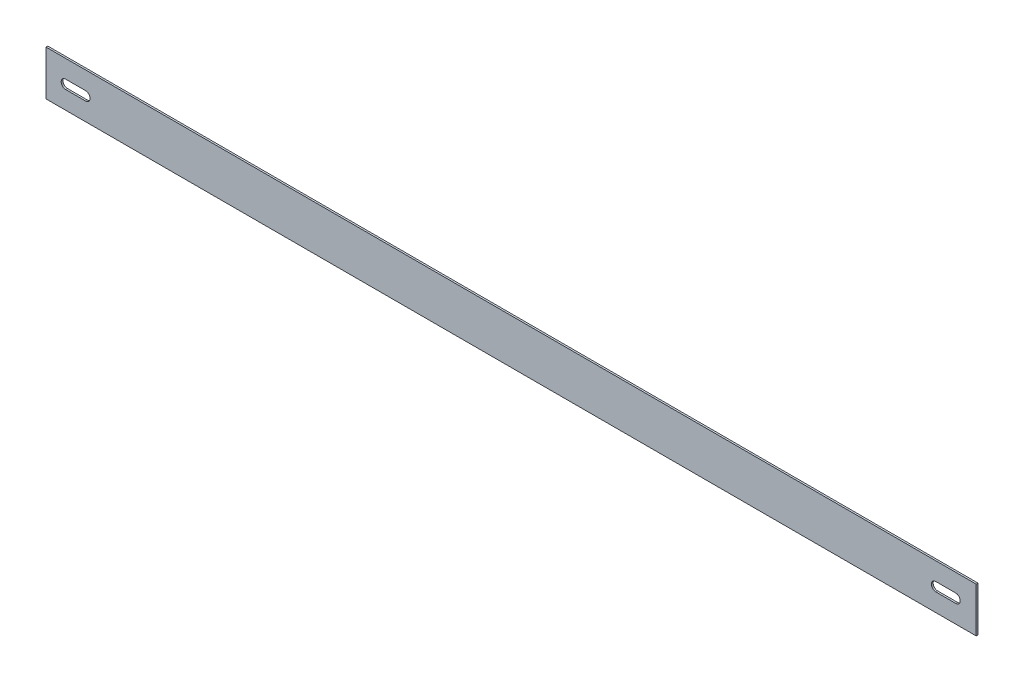
ISO-10303-21;
HEADER;
FILE_DESCRIPTION(('STEP AP214'),'2;1');
FILE_NAME('part.step','',(''),(''),'','','');
FILE_SCHEMA(('AUTOMOTIVE_DESIGN { 1 0 10303 214 1 1 1 1 }'));
ENDSEC;
DATA;
#1=APPLICATION_CONTEXT('core data for automotive mechanical design processes');
#2=APPLICATION_PROTOCOL_DEFINITION('international standard','automotive_design',2000,#1);
#3=PRODUCT_CONTEXT('',#1,'mechanical');
#4=PRODUCT('Part','Part','',(#3));
#5=PRODUCT_RELATED_PRODUCT_CATEGORY('part','',(#4));
#6=PRODUCT_DEFINITION_FORMATION('','',#4);
#7=PRODUCT_DEFINITION_CONTEXT('part definition',#1,'design');
#8=PRODUCT_DEFINITION('design','',#6,#7);
#9=PRODUCT_DEFINITION_SHAPE('','',#8);
#10=(LENGTH_UNIT() NAMED_UNIT(*) SI_UNIT(.MILLI.,.METRE.));
#11=(NAMED_UNIT(*) PLANE_ANGLE_UNIT() SI_UNIT($,.RADIAN.));
#12=(NAMED_UNIT(*) SI_UNIT($,.STERADIAN.) SOLID_ANGLE_UNIT());
#13=UNCERTAINTY_MEASURE_WITH_UNIT(LENGTH_MEASURE(1.E-05),#10,'distance_accuracy_value','');
#14=(GEOMETRIC_REPRESENTATION_CONTEXT(3) GLOBAL_UNCERTAINTY_ASSIGNED_CONTEXT((#13)) GLOBAL_UNIT_ASSIGNED_CONTEXT((#10,
#11,#12)) REPRESENTATION_CONTEXT('',''));
#15=CARTESIAN_POINT('',(0.,0.,0.));
#16=DIRECTION('',(0.,0.,1.));
#17=DIRECTION('',(1.,0.,0.));
#18=AXIS2_PLACEMENT_3D('',#15,#16,#17);
#19=CARTESIAN_POINT('',(-98.,0.,-1.7366));
#20=DIRECTION('',(0.,-1.,0.));
#21=DIRECTION('',(0.,0.,-1.));
#22=AXIS2_PLACEMENT_3D('',#19,#20,#21);
#23=PLANE('',#22);
#24=DIRECTION('',(-1.,0.,0.));
#25=VECTOR('',#24,1.);
#26=CARTESIAN_POINT('',(-99.,0.,0.));
#27=LINE('',#26,#25);
#28=CARTESIAN_POINT('',(258.90399342147,0.,-2.4980018054066E-13));
#29=VERTEX_POINT('',#28);
#30=CARTESIAN_POINT('',(-258.90399342147,0.,-1.38777878078145E-13));
#31=VERTEX_POINT('',#30);
#32=EDGE_CURVE('E71',#29,#31,#27,.T.);
#33=ORIENTED_EDGE('',*,*,#32,.T.);
#34=DIRECTION('',(0.,0.,-1.));
#35=VECTOR('',#34,1.);
#36=CARTESIAN_POINT('',(-258.90399342147,0.,-1.38777878078145E-13));
#37=LINE('',#36,#35);
#38=CARTESIAN_POINT('',(-258.90399342147,0.,-1.00000000000014));
#39=VERTEX_POINT('',#38);
#40=EDGE_CURVE('E199',#31,#39,#37,.T.);
#41=ORIENTED_EDGE('',*,*,#40,.T.);
#42=DIRECTION('',(1.,0.,0.));
#43=VECTOR('',#42,1.);
#44=CARTESIAN_POINT('',(-99.,0.,-1.));
#45=LINE('',#44,#43);
#46=CARTESIAN_POINT('',(258.90399342147,0.,-1.00000000000028));
#47=VERTEX_POINT('',#46);
#48=EDGE_CURVE('E55',#47,#39,#45,.F.);
#49=ORIENTED_EDGE('',*,*,#48,.F.);
#50=DIRECTION('',(0.,0.,1.));
#51=VECTOR('',#50,1.);
#52=CARTESIAN_POINT('',(258.90399342147,0.,-1.00000000000028));
#53=LINE('',#52,#51);
#54=EDGE_CURVE('E256',#47,#29,#53,.T.);
#55=ORIENTED_EDGE('',*,*,#54,.T.);
#56=EDGE_LOOP('',(#33,#41,#49,#55));
#57=FACE_BOUND('',#56,.T.);
#58=ADVANCED_FACE('F51',(#57),#23,.T.);
#59=CARTESIAN_POINT('',(98.,25.,-1.7366));
#60=DIRECTION('',(0.,1.,0.));
#61=DIRECTION('',(0.,0.,1.));
#62=AXIS2_PLACEMENT_3D('',#59,#60,#61);
#63=PLANE('',#62);
#64=DIRECTION('',(-1.,0.,0.));
#65=VECTOR('',#64,1.);
#66=CARTESIAN_POINT('',(-99.,25.,0.));
#67=LINE('',#66,#65);
#68=CARTESIAN_POINT('',(258.90399342147,25.,-2.4980018054066E-13));
#69=VERTEX_POINT('',#68);
#70=CARTESIAN_POINT('',(-258.90399342147,25.,-1.38777878078145E-13));
#71=VERTEX_POINT('',#70);
#72=EDGE_CURVE('E62',#69,#71,#67,.T.);
#73=ORIENTED_EDGE('',*,*,#72,.F.);
#74=DIRECTION('',(0.,0.,1.));
#75=VECTOR('',#74,1.);
#76=CARTESIAN_POINT('',(258.90399342147,25.,-1.00000000000028));
#77=LINE('',#76,#75);
#78=CARTESIAN_POINT('',(258.90399342147,25.,-1.00000000000028));
#79=VERTEX_POINT('',#78);
#80=EDGE_CURVE('E263',#79,#69,#77,.T.);
#81=ORIENTED_EDGE('',*,*,#80,.F.);
#82=DIRECTION('',(1.,0.,0.));
#83=VECTOR('',#82,1.);
#84=CARTESIAN_POINT('',(-99.,25.,-1.));
#85=LINE('',#84,#83);
#86=CARTESIAN_POINT('',(-258.90399342147,25.,-1.00000000000014));
#87=VERTEX_POINT('',#86);
#88=EDGE_CURVE('E12',#79,#87,#85,.F.);
#89=ORIENTED_EDGE('',*,*,#88,.T.);
#90=DIRECTION('',(0.,0.,-1.));
#91=VECTOR('',#90,1.);
#92=CARTESIAN_POINT('',(-258.90399342147,25.,-1.38777878078145E-13));
#93=LINE('',#92,#91);
#94=EDGE_CURVE('E233',#71,#87,#93,.T.);
#95=ORIENTED_EDGE('',*,*,#94,.F.);
#96=EDGE_LOOP('',(#73,#81,#89,#95));
#97=FACE_BOUND('',#96,.T.);
#98=ADVANCED_FACE('F317',(#97),#63,.T.);
#99=CARTESIAN_POINT('',(-99.,25.,0.));
#100=DIRECTION('',(0.,0.,1.));
#101=DIRECTION('',(1.,0.,0.));
#102=AXIS2_PLACEMENT_3D('',#99,#100,#101);
#103=PLANE('',#102);
#104=ORIENTED_EDGE('',*,*,#32,.F.);
#105=DIRECTION('',(0.,-1.,0.));
#106=VECTOR('',#105,1.);
#107=CARTESIAN_POINT('',(258.90399342147,25.,-2.4980018054066E-13));
#108=LINE('',#107,#106);
#109=EDGE_CURVE('E259',#69,#29,#108,.T.);
#110=ORIENTED_EDGE('',*,*,#109,.F.);
#111=ORIENTED_EDGE('',*,*,#72,.T.);
#112=DIRECTION('',(0.,-1.,0.));
#113=VECTOR('',#112,1.);
#114=CARTESIAN_POINT('',(-258.90399342147,25.,-1.38777878078145E-13));
#115=LINE('',#114,#113);
#116=EDGE_CURVE('E180',#71,#31,#115,.T.);
#117=ORIENTED_EDGE('',*,*,#116,.T.);
#118=EDGE_LOOP('',(#104,#110,#111,#117));
#119=FACE_BOUND('',#118,.T.);
#120=CARTESIAN_POINT('',(-247.947003759829,12.5,0.));
#121=DIRECTION('',(0.,0.,1.));
#122=DIRECTION('',(1.,0.,0.));
#123=AXIS2_PLACEMENT_3D('',#120,#121,#122);
#124=CIRCLE('',#123,2.5);
#125=CARTESIAN_POINT('',(-247.947003759829,15.,0.));
#126=VERTEX_POINT('',#125);
#127=CARTESIAN_POINT('',(-247.947003759829,10.,0.));
#128=VERTEX_POINT('',#127);
#129=EDGE_CURVE('E206',#126,#128,#124,.T.);
#130=ORIENTED_EDGE('',*,*,#129,.F.);
#131=DIRECTION('',(1.,0.,0.));
#132=VECTOR('',#131,1.);
#133=CARTESIAN_POINT('',(-242.421237076163,15.,0.));
#134=LINE('',#133,#132);
#135=CARTESIAN_POINT('',(-236.895470392496,15.,0.));
#136=VERTEX_POINT('',#135);
#137=EDGE_CURVE('E213',#136,#126,#134,.F.);
#138=ORIENTED_EDGE('',*,*,#137,.F.);
#139=CARTESIAN_POINT('',(-236.895470392496,12.5,1.2490009027033E-13));
#140=DIRECTION('',(0.,0.,1.));
#141=DIRECTION('',(1.,0.,0.));
#142=AXIS2_PLACEMENT_3D('',#139,#140,#141);
#143=CIRCLE('',#142,2.5);
#144=CARTESIAN_POINT('',(-236.895470392496,10.,1.2490009027033E-13));
#145=VERTEX_POINT('',#144);
#146=EDGE_CURVE('E219',#145,#136,#143,.T.);
#147=ORIENTED_EDGE('',*,*,#146,.F.);
#148=DIRECTION('',(1.,0.,0.));
#149=VECTOR('',#148,1.);
#150=CARTESIAN_POINT('',(-242.421237076163,10.,0.));
#151=LINE('',#150,#149);
#152=EDGE_CURVE('E226',#128,#145,#151,.T.);
#153=ORIENTED_EDGE('',*,*,#152,.F.);
#154=EDGE_LOOP('',(#130,#138,#147,#153));
#155=FACE_BOUND('',#154,.T.);
#156=DIRECTION('',(1.,0.,0.));
#157=VECTOR('',#156,1.);
#158=CARTESIAN_POINT('',(258.90399342147,9.99999999999999,-2.4980018054066E-13));
#159=LINE('',#158,#157);
#160=CARTESIAN_POINT('',(236.447274908041,10.,0.));
#161=VERTEX_POINT('',#160);
#162=CARTESIAN_POINT('',(247.498876046859,9.99999999999999,0.));
#163=VERTEX_POINT('',#162);
#164=EDGE_CURVE('E267',#161,#163,#159,.T.);
#165=ORIENTED_EDGE('',*,*,#164,.F.);
#166=CARTESIAN_POINT('',(236.447274908041,12.5,0.));
#167=DIRECTION('',(0.,0.,1.));
#168=DIRECTION('',(1.,0.,0.));
#169=AXIS2_PLACEMENT_3D('',#166,#167,#168);
#170=ELLIPSE('',#169,2.50001533078762,2.5);
#171=CARTESIAN_POINT('',(236.447274908041,15.,0.));
#172=VERTEX_POINT('',#171);
#173=EDGE_CURVE('E170',#172,#161,#170,.T.);
#174=ORIENTED_EDGE('',*,*,#173,.F.);
#175=DIRECTION('',(1.,0.,0.));
#176=VECTOR('',#175,1.);
#177=CARTESIAN_POINT('',(258.90399342147,15.,-2.4980018054066E-13));
#178=LINE('',#177,#176);
#179=CARTESIAN_POINT('',(247.498876046859,15.,0.));
#180=VERTEX_POINT('',#179);
#181=EDGE_CURVE('E164',#180,#172,#178,.F.);
#182=ORIENTED_EDGE('',*,*,#181,.F.);
#183=CARTESIAN_POINT('',(247.498876046859,12.5,0.));
#184=DIRECTION('',(0.,0.,1.));
#185=DIRECTION('',(1.,0.,0.));
#186=AXIS2_PLACEMENT_3D('',#183,#184,#185);
#187=ELLIPSE('',#186,2.50001533078761,2.5);
#188=EDGE_CURVE('E152',#163,#180,#187,.T.);
#189=ORIENTED_EDGE('',*,*,#188,.F.);
#190=EDGE_LOOP('',(#165,#174,#182,#189));
#191=FACE_BOUND('',#190,.T.);
#192=ADVANCED_FACE('F53',(#119,#155,#191),#103,.T.);
#193=CARTESIAN_POINT('',(-99.,25.,-1.));
#194=DIRECTION('',(0.,0.,1.));
#195=DIRECTION('',(1.,0.,0.));
#196=AXIS2_PLACEMENT_3D('',#193,#194,#195);
#197=PLANE('',#196);
#198=ORIENTED_EDGE('',*,*,#48,.T.);
#199=DIRECTION('',(0.,-1.,0.));
#200=VECTOR('',#199,1.);
#201=CARTESIAN_POINT('',(-258.90399342147,25.,-1.00000000000014));
#202=LINE('',#201,#200);
#203=EDGE_CURVE('E230',#87,#39,#202,.T.);
#204=ORIENTED_EDGE('',*,*,#203,.F.);
#205=ORIENTED_EDGE('',*,*,#88,.F.);
#206=DIRECTION('',(0.,-1.,0.));
#207=VECTOR('',#206,1.);
#208=CARTESIAN_POINT('',(258.90399342147,25.,-1.00000000000028));
#209=LINE('',#208,#207);
#210=EDGE_CURVE('E253',#79,#47,#209,.T.);
#211=ORIENTED_EDGE('',*,*,#210,.T.);
#212=EDGE_LOOP('',(#198,#204,#205,#211));
#213=FACE_BOUND('',#212,.T.);
#214=DIRECTION('',(-1.,0.,0.));
#215=VECTOR('',#214,1.);
#216=CARTESIAN_POINT('',(-247.947003759829,15.,-1.00000000000001));
#217=LINE('',#216,#215);
#218=CARTESIAN_POINT('',(-236.895470392496,15.,-0.999999999999876));
#219=VERTEX_POINT('',#218);
#220=CARTESIAN_POINT('',(-247.947003759829,15.,-1.00000000000001));
#221=VERTEX_POINT('',#220);
#222=EDGE_CURVE('E195',#219,#221,#217,.T.);
#223=ORIENTED_EDGE('',*,*,#222,.T.);
#224=CARTESIAN_POINT('',(-247.947003759829,12.5,-1.00000000000001));
#225=DIRECTION('',(0.,0.,1.));
#226=DIRECTION('',(-1.,0.,0.));
#227=AXIS2_PLACEMENT_3D('',#224,#225,#226);
#228=CIRCLE('',#227,2.5);
#229=CARTESIAN_POINT('',(-247.947003759829,10.,-1.00000000000001));
#230=VERTEX_POINT('',#229);
#231=EDGE_CURVE('E191',#221,#230,#228,.T.);
#232=ORIENTED_EDGE('',*,*,#231,.T.);
#233=DIRECTION('',(1.,0.,0.));
#234=VECTOR('',#233,1.);
#235=CARTESIAN_POINT('',(-247.947003759829,10.,-0.999999999999987));
#236=LINE('',#235,#234);
#237=CARTESIAN_POINT('',(-236.895470392496,10.,-0.999999999999876));
#238=VERTEX_POINT('',#237);
#239=EDGE_CURVE('E187',#230,#238,#236,.T.);
#240=ORIENTED_EDGE('',*,*,#239,.T.);
#241=CARTESIAN_POINT('',(-236.895470392496,12.5,-0.999999999999876));
#242=DIRECTION('',(0.,0.,1.));
#243=DIRECTION('',(-1.,0.,0.));
#244=AXIS2_PLACEMENT_3D('',#241,#242,#243);
#245=CIRCLE('',#244,2.5);
#246=EDGE_CURVE('E183',#238,#219,#245,.T.);
#247=ORIENTED_EDGE('',*,*,#246,.T.);
#248=EDGE_LOOP('',(#223,#232,#240,#247));
#249=FACE_BOUND('',#248,.T.);
#250=CARTESIAN_POINT('',(236.447274908041,12.5,-0.999999999999945));
#251=DIRECTION('',(0.,0.,1.));
#252=DIRECTION('',(1.,0.,0.));
#253=AXIS2_PLACEMENT_3D('',#250,#251,#252);
#254=ELLIPSE('',#253,2.50001533078762,2.5);
#255=CARTESIAN_POINT('',(236.447274908041,15.,-0.999999999999945));
#256=VERTEX_POINT('',#255);
#257=CARTESIAN_POINT('',(236.447274908041,10.,-0.999999999999945));
#258=VERTEX_POINT('',#257);
#259=EDGE_CURVE('E249',#256,#258,#254,.T.);
#260=ORIENTED_EDGE('',*,*,#259,.T.);
#261=DIRECTION('',(1.,0.,0.));
#262=VECTOR('',#261,1.);
#263=CARTESIAN_POINT('',(258.90399342147,10.,-1.00000000000028));
#264=LINE('',#263,#262);
#265=CARTESIAN_POINT('',(247.498876046859,10.,-1.00000000000011));
#266=VERTEX_POINT('',#265);
#267=EDGE_CURVE('E245',#258,#266,#264,.T.);
#268=ORIENTED_EDGE('',*,*,#267,.T.);
#269=CARTESIAN_POINT('',(247.498876046859,12.5,-1.00000000000011));
#270=DIRECTION('',(0.,0.,1.));
#271=DIRECTION('',(1.,0.,0.));
#272=AXIS2_PLACEMENT_3D('',#269,#270,#271);
#273=ELLIPSE('',#272,2.50001533078761,2.5);
#274=CARTESIAN_POINT('',(247.498876046859,15.,-1.00000000000011));
#275=VERTEX_POINT('',#274);
#276=EDGE_CURVE('E242',#266,#275,#273,.T.);
#277=ORIENTED_EDGE('',*,*,#276,.T.);
#278=DIRECTION('',(-1.,0.,0.));
#279=VECTOR('',#278,1.);
#280=CARTESIAN_POINT('',(258.90399342147,15.,-1.00000000000028));
#281=LINE('',#280,#279);
#282=EDGE_CURVE('E146',#275,#256,#281,.T.);
#283=ORIENTED_EDGE('',*,*,#282,.T.);
#284=EDGE_LOOP('',(#260,#268,#277,#283));
#285=FACE_BOUND('',#284,.T.);
#286=ADVANCED_FACE('F298',(#213,#249,#285),#197,.F.);
#287=CARTESIAN_POINT('',(-258.90399342147,25.,-1.38777878078145E-13));
#288=DIRECTION('',(-1.,0.,0.));
#289=DIRECTION('',(0.,0.,1.));
#290=AXIS2_PLACEMENT_3D('',#287,#288,#289);
#291=PLANE('',#290);
#292=ORIENTED_EDGE('',*,*,#40,.F.);
#293=ORIENTED_EDGE('',*,*,#116,.F.);
#294=ORIENTED_EDGE('',*,*,#94,.T.);
#295=ORIENTED_EDGE('',*,*,#203,.T.);
#296=EDGE_LOOP('',(#292,#293,#294,#295));
#297=FACE_BOUND('',#296,.T.);
#298=ADVANCED_FACE('F294',(#297),#291,.T.);
#299=CARTESIAN_POINT('',(-247.947003759829,10.,-0.999999999999987));
#300=DIRECTION('',(0.,-1.,0.));
#301=DIRECTION('',(1.,0.,0.));
#302=AXIS2_PLACEMENT_3D('',#299,#300,#301);
#303=PLANE('',#302);
#304=DIRECTION('',(0.,0.,1.));
#305=VECTOR('',#304,1.);
#306=CARTESIAN_POINT('',(-247.947003759829,10.,-1.00000000000001));
#307=LINE('',#306,#305);
#308=EDGE_CURVE('E202',#128,#230,#307,.F.);
#309=ORIENTED_EDGE('',*,*,#308,.F.);
#310=ORIENTED_EDGE('',*,*,#152,.T.);
#311=DIRECTION('',(0.,0.,1.));
#312=VECTOR('',#311,1.);
#313=CARTESIAN_POINT('',(-236.895470392496,10.,-0.999999999999876));
#314=LINE('',#313,#312);
#315=EDGE_CURVE('E222',#145,#238,#314,.F.);
#316=ORIENTED_EDGE('',*,*,#315,.T.);
#317=ORIENTED_EDGE('',*,*,#239,.F.);
#318=EDGE_LOOP('',(#309,#310,#316,#317));
#319=FACE_BOUND('',#318,.T.);
#320=ADVANCED_FACE('F297',(#319),#303,.F.);
#321=CARTESIAN_POINT('',(-236.895470392496,12.5,-0.999999999999876));
#322=DIRECTION('',(0.,0.,1.));
#323=DIRECTION('',(1.,0.,0.));
#324=AXIS2_PLACEMENT_3D('',#321,#322,#323);
#325=CYLINDRICAL_SURFACE('',#324,2.5);
#326=ORIENTED_EDGE('',*,*,#146,.T.);
#327=DIRECTION('',(0.,0.,1.));
#328=VECTOR('',#327,1.);
#329=CARTESIAN_POINT('',(-236.895470392496,15.,-0.999999999999904));
#330=LINE('',#329,#328);
#331=EDGE_CURVE('E216',#136,#219,#330,.F.);
#332=ORIENTED_EDGE('',*,*,#331,.T.);
#333=ORIENTED_EDGE('',*,*,#246,.F.);
#334=ORIENTED_EDGE('',*,*,#315,.F.);
#335=EDGE_LOOP('',(#326,#332,#333,#334));
#336=FACE_BOUND('',#335,.T.);
#337=ADVANCED_FACE('F302',(#336),#325,.F.);
#338=CARTESIAN_POINT('',(-247.947003759829,15.,-1.00000000000001));
#339=DIRECTION('',(0.,1.,0.));
#340=DIRECTION('',(-1.,0.,0.));
#341=AXIS2_PLACEMENT_3D('',#338,#339,#340);
#342=PLANE('',#341);
#343=ORIENTED_EDGE('',*,*,#331,.F.);
#344=ORIENTED_EDGE('',*,*,#137,.T.);
#345=DIRECTION('',(0.,0.,1.));
#346=VECTOR('',#345,1.);
#347=CARTESIAN_POINT('',(-247.947003759829,15.,-1.00000000000001));
#348=LINE('',#347,#346);
#349=EDGE_CURVE('E209',#126,#221,#348,.F.);
#350=ORIENTED_EDGE('',*,*,#349,.T.);
#351=ORIENTED_EDGE('',*,*,#222,.F.);
#352=EDGE_LOOP('',(#343,#344,#350,#351));
#353=FACE_BOUND('',#352,.T.);
#354=ADVANCED_FACE('F306',(#353),#342,.F.);
#355=CARTESIAN_POINT('',(-247.947003759829,12.5,-1.00000000000001));
#356=DIRECTION('',(0.,0.,1.));
#357=DIRECTION('',(1.,0.,0.));
#358=AXIS2_PLACEMENT_3D('',#355,#356,#357);
#359=CYLINDRICAL_SURFACE('',#358,2.5);
#360=ORIENTED_EDGE('',*,*,#349,.F.);
#361=ORIENTED_EDGE('',*,*,#129,.T.);
#362=ORIENTED_EDGE('',*,*,#308,.T.);
#363=ORIENTED_EDGE('',*,*,#231,.F.);
#364=EDGE_LOOP('',(#360,#361,#362,#363));
#365=FACE_BOUND('',#364,.T.);
#366=ADVANCED_FACE('F310',(#365),#359,.F.);
#367=CARTESIAN_POINT('',(247.498876046859,12.5,-1.00000000000011));
#368=DIRECTION('',(0.,0.,1.));
#369=DIRECTION('',(1.,0.,0.));
#370=AXIS2_PLACEMENT_3D('',#367,#368,#369);
#371=ELLIPSE('',#370,2.50001533078761,2.5);
#372=DIRECTION('',(0.,0.,1.));
#373=VECTOR('',#372,1.);
#374=SURFACE_OF_LINEAR_EXTRUSION('',#371,#373);
#375=DIRECTION('',(0.,0.,-1.));
#376=VECTOR('',#375,1.);
#377=CARTESIAN_POINT('',(247.498876046859,15.,-1.00000000000011));
#378=LINE('',#377,#376);
#379=EDGE_CURVE('E155',#275,#180,#378,.F.);
#380=ORIENTED_EDGE('',*,*,#379,.F.);
#381=ORIENTED_EDGE('',*,*,#276,.F.);
#382=DIRECTION('',(0.,0.,-1.));
#383=VECTOR('',#382,1.);
#384=CARTESIAN_POINT('',(247.498876046859,10.,-1.00000000000011));
#385=LINE('',#384,#383);
#386=EDGE_CURVE('E157',#266,#163,#385,.F.);
#387=ORIENTED_EDGE('',*,*,#386,.T.);
#388=ORIENTED_EDGE('',*,*,#188,.T.);
#389=EDGE_LOOP('',(#380,#381,#387,#388));
#390=FACE_BOUND('',#389,.T.);
#391=ADVANCED_FACE('F153',(#390),#374,.F.);
#392=CARTESIAN_POINT('',(258.90399342147,15.,-1.00000000000028));
#393=DIRECTION('',(0.,1.,0.));
#394=DIRECTION('',(-1.,0.,0.));
#395=AXIS2_PLACEMENT_3D('',#392,#393,#394);
#396=PLANE('',#395);
#397=DIRECTION('',(0.,0.,-1.));
#398=VECTOR('',#397,1.);
#399=CARTESIAN_POINT('',(236.447274908041,15.,-0.999999999999945));
#400=LINE('',#399,#398);
#401=EDGE_CURVE('E172',#256,#172,#400,.F.);
#402=ORIENTED_EDGE('',*,*,#401,.F.);
#403=ORIENTED_EDGE('',*,*,#282,.F.);
#404=ORIENTED_EDGE('',*,*,#379,.T.);
#405=ORIENTED_EDGE('',*,*,#181,.T.);
#406=EDGE_LOOP('',(#402,#403,#404,#405));
#407=FACE_BOUND('',#406,.T.);
#408=ADVANCED_FACE('F163',(#407),#396,.F.);
#409=CARTESIAN_POINT('',(236.447274908041,12.5,-0.999999999999945));
#410=DIRECTION('',(0.,0.,1.));
#411=DIRECTION('',(1.,0.,0.));
#412=AXIS2_PLACEMENT_3D('',#409,#410,#411);
#413=ELLIPSE('',#412,2.50001533078762,2.5);
#414=DIRECTION('',(0.,0.,1.));
#415=VECTOR('',#414,1.);
#416=SURFACE_OF_LINEAR_EXTRUSION('',#413,#415);
#417=DIRECTION('',(0.,0.,-1.));
#418=VECTOR('',#417,1.);
#419=CARTESIAN_POINT('',(236.447274908041,10.,-0.999999999999945));
#420=LINE('',#419,#418);
#421=EDGE_CURVE('E270',#258,#161,#420,.F.);
#422=ORIENTED_EDGE('',*,*,#421,.F.);
#423=ORIENTED_EDGE('',*,*,#259,.F.);
#424=ORIENTED_EDGE('',*,*,#401,.T.);
#425=ORIENTED_EDGE('',*,*,#173,.T.);
#426=EDGE_LOOP('',(#422,#423,#424,#425));
#427=FACE_BOUND('',#426,.T.);
#428=ADVANCED_FACE('F281',(#427),#416,.F.);
#429=CARTESIAN_POINT('',(258.90399342147,10.,-1.00000000000028));
#430=DIRECTION('',(0.,-1.,0.));
#431=DIRECTION('',(1.,0.,0.));
#432=AXIS2_PLACEMENT_3D('',#429,#430,#431);
#433=PLANE('',#432);
#434=ORIENTED_EDGE('',*,*,#267,.F.);
#435=ORIENTED_EDGE('',*,*,#421,.T.);
#436=ORIENTED_EDGE('',*,*,#164,.T.);
#437=ORIENTED_EDGE('',*,*,#386,.F.);
#438=EDGE_LOOP('',(#434,#435,#436,#437));
#439=FACE_BOUND('',#438,.T.);
#440=ADVANCED_FACE('F285',(#439),#433,.F.);
#441=CARTESIAN_POINT('',(258.90399342147,25.,-1.00000000000028));
#442=DIRECTION('',(1.,0.,0.));
#443=DIRECTION('',(0.,0.,-1.));
#444=AXIS2_PLACEMENT_3D('',#441,#442,#443);
#445=PLANE('',#444);
#446=ORIENTED_EDGE('',*,*,#54,.F.);
#447=ORIENTED_EDGE('',*,*,#210,.F.);
#448=ORIENTED_EDGE('',*,*,#80,.T.);
#449=ORIENTED_EDGE('',*,*,#109,.T.);
#450=EDGE_LOOP('',(#446,#447,#448,#449));
#451=FACE_BOUND('',#450,.T.);
#452=ADVANCED_FACE('F289',(#451),#445,.T.);
#453=CLOSED_SHELL('',(#58,#98,#192,#286,#298,#320,#337,#354,#366,#391,#408,#428,#440,#452));
#454=MANIFOLD_SOLID_BREP('B2',#453);
#455=ADVANCED_BREP_SHAPE_REPRESENTATION('',(#18,#454),#14);
#456=SHAPE_DEFINITION_REPRESENTATION(#9,#455);
ENDSEC;
END-ISO-10303-21;
